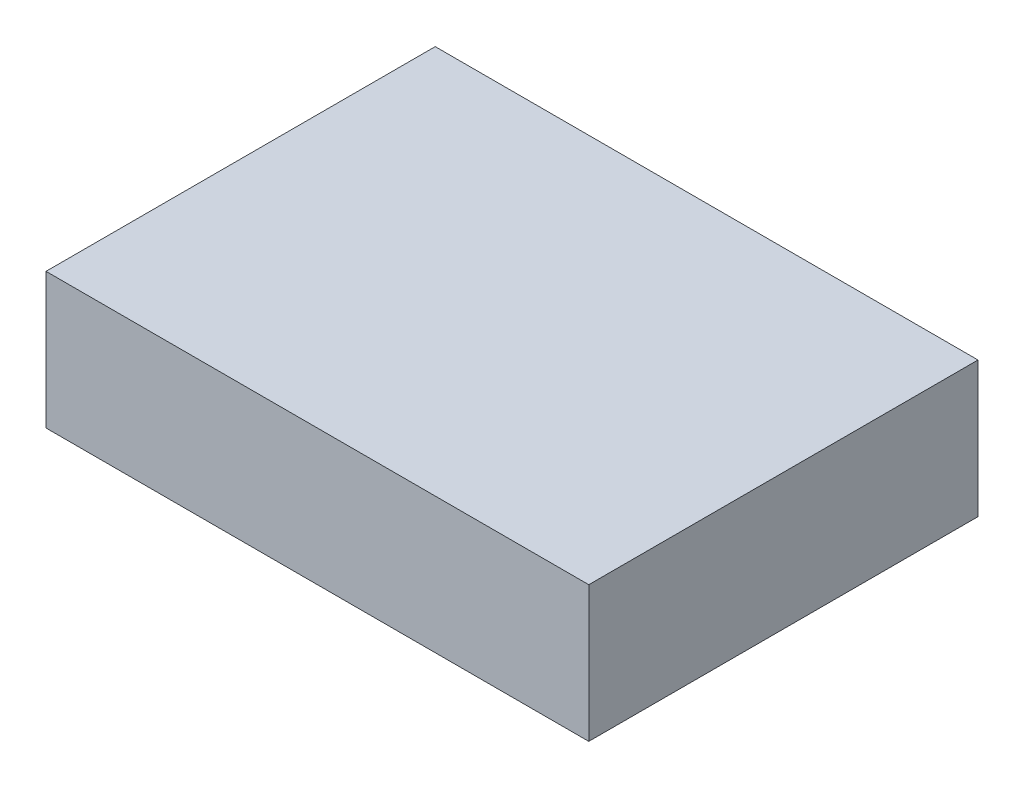
ISO-10303-21;
HEADER;
FILE_DESCRIPTION(('STEP AP214'),'2;1');
FILE_NAME('part.step','',(''),(''),'','','');
FILE_SCHEMA(('AUTOMOTIVE_DESIGN { 1 0 10303 214 1 1 1 1 }'));
ENDSEC;
DATA;
#1=APPLICATION_CONTEXT('core data for automotive mechanical design processes');
#2=APPLICATION_PROTOCOL_DEFINITION('international standard','automotive_design',2000,#1);
#3=PRODUCT_CONTEXT('',#1,'mechanical');
#4=PRODUCT('Part','Part','',(#3));
#5=PRODUCT_RELATED_PRODUCT_CATEGORY('part','',(#4));
#6=PRODUCT_DEFINITION_FORMATION('','',#4);
#7=PRODUCT_DEFINITION_CONTEXT('part definition',#1,'design');
#8=PRODUCT_DEFINITION('design','',#6,#7);
#9=PRODUCT_DEFINITION_SHAPE('','',#8);
#10=(LENGTH_UNIT() NAMED_UNIT(*) SI_UNIT(.MILLI.,.METRE.));
#11=(NAMED_UNIT(*) PLANE_ANGLE_UNIT() SI_UNIT($,.RADIAN.));
#12=(NAMED_UNIT(*) SI_UNIT($,.STERADIAN.) SOLID_ANGLE_UNIT());
#13=UNCERTAINTY_MEASURE_WITH_UNIT(LENGTH_MEASURE(1.E-05),#10,'distance_accuracy_value','');
#14=(GEOMETRIC_REPRESENTATION_CONTEXT(3) GLOBAL_UNCERTAINTY_ASSIGNED_CONTEXT((#13)) GLOBAL_UNIT_ASSIGNED_CONTEXT((#10,
#11,#12)) REPRESENTATION_CONTEXT('',''));
#15=CARTESIAN_POINT('',(0.,0.,0.));
#16=DIRECTION('',(0.,0.,1.));
#17=DIRECTION('',(1.,0.,0.));
#18=AXIS2_PLACEMENT_3D('',#15,#16,#17);
#19=CARTESIAN_POINT('',(1.0668,0.2667,0.));
#20=DIRECTION('',(0.,-1.,0.));
#21=DIRECTION('',(0.,0.,-1.));
#22=AXIS2_PLACEMENT_3D('',#19,#20,#21);
#23=PLANE('',#22);
#24=DIRECTION('',(0.,0.,-1.));
#25=VECTOR('',#24,1.);
#26=CARTESIAN_POINT('',(-1.0668,0.2667,0.));
#27=LINE('',#26,#25);
#28=CARTESIAN_POINT('',(-1.0668,0.2667,1.53));
#29=VERTEX_POINT('',#28);
#30=CARTESIAN_POINT('',(-1.0668,0.2667,0.));
#31=VERTEX_POINT('',#30);
#32=EDGE_CURVE('E47',#29,#31,#27,.T.);
#33=ORIENTED_EDGE('',*,*,#32,.F.);
#34=DIRECTION('',(-1.,0.,0.));
#35=VECTOR('',#34,1.);
#36=CARTESIAN_POINT('',(1.0668,0.2667,1.53));
#37=LINE('',#36,#35);
#38=CARTESIAN_POINT('',(1.0668,0.2667,1.53));
#39=VERTEX_POINT('',#38);
#40=EDGE_CURVE('E106',#39,#29,#37,.T.);
#41=ORIENTED_EDGE('',*,*,#40,.F.);
#42=DIRECTION('',(0.,0.,1.));
#43=VECTOR('',#42,1.);
#44=CARTESIAN_POINT('',(1.0668,0.2667,0.));
#45=LINE('',#44,#43);
#46=CARTESIAN_POINT('',(1.0668,0.2667,0.));
#47=VERTEX_POINT('',#46);
#48=EDGE_CURVE('E82',#47,#39,#45,.T.);
#49=ORIENTED_EDGE('',*,*,#48,.F.);
#50=DIRECTION('',(1.,0.,0.));
#51=VECTOR('',#50,1.);
#52=CARTESIAN_POINT('',(1.0668,0.2667,0.));
#53=LINE('',#52,#51);
#54=EDGE_CURVE('E11',#31,#47,#53,.T.);
#55=ORIENTED_EDGE('',*,*,#54,.F.);
#56=EDGE_LOOP('',(#33,#41,#49,#55));
#57=FACE_BOUND('',#56,.T.);
#58=ADVANCED_FACE('F16',(#57),#23,.F.);
#59=CARTESIAN_POINT('',(1.0668,-0.2667,0.));
#60=DIRECTION('',(0.,0.,-1.));
#61=DIRECTION('',(0.,-1.,0.));
#62=AXIS2_PLACEMENT_3D('',#59,#60,#61);
#63=PLANE('',#62);
#64=ORIENTED_EDGE('',*,*,#54,.T.);
#65=DIRECTION('',(0.,-1.,0.));
#66=VECTOR('',#65,1.);
#67=CARTESIAN_POINT('',(1.0668,-0.2667,0.));
#68=LINE('',#67,#66);
#69=CARTESIAN_POINT('',(1.0668,-0.2667,0.));
#70=VERTEX_POINT('',#69);
#71=EDGE_CURVE('E84',#47,#70,#68,.T.);
#72=ORIENTED_EDGE('',*,*,#71,.T.);
#73=DIRECTION('',(-1.,0.,0.));
#74=VECTOR('',#73,1.);
#75=CARTESIAN_POINT('',(1.0668,-0.2667,0.));
#76=LINE('',#75,#74);
#77=CARTESIAN_POINT('',(-1.0668,-0.2667,0.));
#78=VERTEX_POINT('',#77);
#79=EDGE_CURVE('E96',#70,#78,#76,.T.);
#80=ORIENTED_EDGE('',*,*,#79,.T.);
#81=DIRECTION('',(0.,1.,0.));
#82=VECTOR('',#81,1.);
#83=CARTESIAN_POINT('',(-1.0668,-0.2667,0.));
#84=LINE('',#83,#82);
#85=EDGE_CURVE('E26',#78,#31,#84,.T.);
#86=ORIENTED_EDGE('',*,*,#85,.T.);
#87=EDGE_LOOP('',(#64,#72,#80,#86));
#88=FACE_BOUND('',#87,.T.);
#89=ADVANCED_FACE('F18',(#88),#63,.T.);
#90=CARTESIAN_POINT('',(-1.0668,0.2667,0.));
#91=DIRECTION('',(1.,0.,0.));
#92=DIRECTION('',(0.,1.,0.));
#93=AXIS2_PLACEMENT_3D('',#90,#91,#92);
#94=PLANE('',#93);
#95=DIRECTION('',(0.,0.,-1.));
#96=VECTOR('',#95,1.);
#97=CARTESIAN_POINT('',(-1.0668,-0.2667,0.));
#98=LINE('',#97,#96);
#99=CARTESIAN_POINT('',(-1.0668,-0.2667,1.53));
#100=VERTEX_POINT('',#99);
#101=EDGE_CURVE('E91',#100,#78,#98,.T.);
#102=ORIENTED_EDGE('',*,*,#101,.F.);
#103=DIRECTION('',(0.,-1.,0.));
#104=VECTOR('',#103,1.);
#105=CARTESIAN_POINT('',(-1.0668,0.2667,1.53));
#106=LINE('',#105,#104);
#107=EDGE_CURVE('E69',#29,#100,#106,.T.);
#108=ORIENTED_EDGE('',*,*,#107,.F.);
#109=ORIENTED_EDGE('',*,*,#32,.T.);
#110=ORIENTED_EDGE('',*,*,#85,.F.);
#111=EDGE_LOOP('',(#102,#108,#109,#110));
#112=FACE_BOUND('',#111,.T.);
#113=ADVANCED_FACE('F115',(#112),#94,.F.);
#114=CARTESIAN_POINT('',(1.0668,-0.2667,1.53));
#115=DIRECTION('',(0.,0.,-1.));
#116=DIRECTION('',(0.,-1.,0.));
#117=AXIS2_PLACEMENT_3D('',#114,#115,#116);
#118=PLANE('',#117);
#119=ORIENTED_EDGE('',*,*,#40,.T.);
#120=ORIENTED_EDGE('',*,*,#107,.T.);
#121=DIRECTION('',(-1.,0.,0.));
#122=VECTOR('',#121,1.);
#123=CARTESIAN_POINT('',(1.0668,-0.2667,1.53));
#124=LINE('',#123,#122);
#125=CARTESIAN_POINT('',(1.0668,-0.2667,1.53));
#126=VERTEX_POINT('',#125);
#127=EDGE_CURVE('E86',#126,#100,#124,.T.);
#128=ORIENTED_EDGE('',*,*,#127,.F.);
#129=DIRECTION('',(0.,-1.,0.));
#130=VECTOR('',#129,1.);
#131=CARTESIAN_POINT('',(1.0668,-0.2667,1.53));
#132=LINE('',#131,#130);
#133=EDGE_CURVE('E20',#39,#126,#132,.T.);
#134=ORIENTED_EDGE('',*,*,#133,.F.);
#135=EDGE_LOOP('',(#119,#120,#128,#134));
#136=FACE_BOUND('',#135,.T.);
#137=ADVANCED_FACE('F87',(#136),#118,.F.);
#138=CARTESIAN_POINT('',(1.0668,-0.2667,0.));
#139=DIRECTION('',(-1.,0.,0.));
#140=DIRECTION('',(0.,0.,1.));
#141=AXIS2_PLACEMENT_3D('',#138,#139,#140);
#142=PLANE('',#141);
#143=ORIENTED_EDGE('',*,*,#48,.T.);
#144=ORIENTED_EDGE('',*,*,#133,.T.);
#145=DIRECTION('',(0.,0.,1.));
#146=VECTOR('',#145,1.);
#147=CARTESIAN_POINT('',(1.0668,-0.2667,0.));
#148=LINE('',#147,#146);
#149=EDGE_CURVE('E81',#70,#126,#148,.T.);
#150=ORIENTED_EDGE('',*,*,#149,.F.);
#151=ORIENTED_EDGE('',*,*,#71,.F.);
#152=EDGE_LOOP('',(#143,#144,#150,#151));
#153=FACE_BOUND('',#152,.T.);
#154=ADVANCED_FACE('F78',(#153),#142,.F.);
#155=CARTESIAN_POINT('',(-1.0668,-0.2667,0.));
#156=DIRECTION('',(0.,1.,0.));
#157=DIRECTION('',(1.,0.,0.));
#158=AXIS2_PLACEMENT_3D('',#155,#156,#157);
#159=PLANE('',#158);
#160=ORIENTED_EDGE('',*,*,#149,.T.);
#161=ORIENTED_EDGE('',*,*,#127,.T.);
#162=ORIENTED_EDGE('',*,*,#101,.T.);
#163=ORIENTED_EDGE('',*,*,#79,.F.);
#164=EDGE_LOOP('',(#160,#161,#162,#163));
#165=FACE_BOUND('',#164,.T.);
#166=ADVANCED_FACE('F94',(#165),#159,.F.);
#167=CLOSED_SHELL('',(#58,#89,#113,#137,#154,#166));
#168=MANIFOLD_SOLID_BREP('B1',#167);
#169=ADVANCED_BREP_SHAPE_REPRESENTATION('',(#18,#168),#14);
#170=SHAPE_DEFINITION_REPRESENTATION(#9,#169);
ENDSEC;
END-ISO-10303-21;
